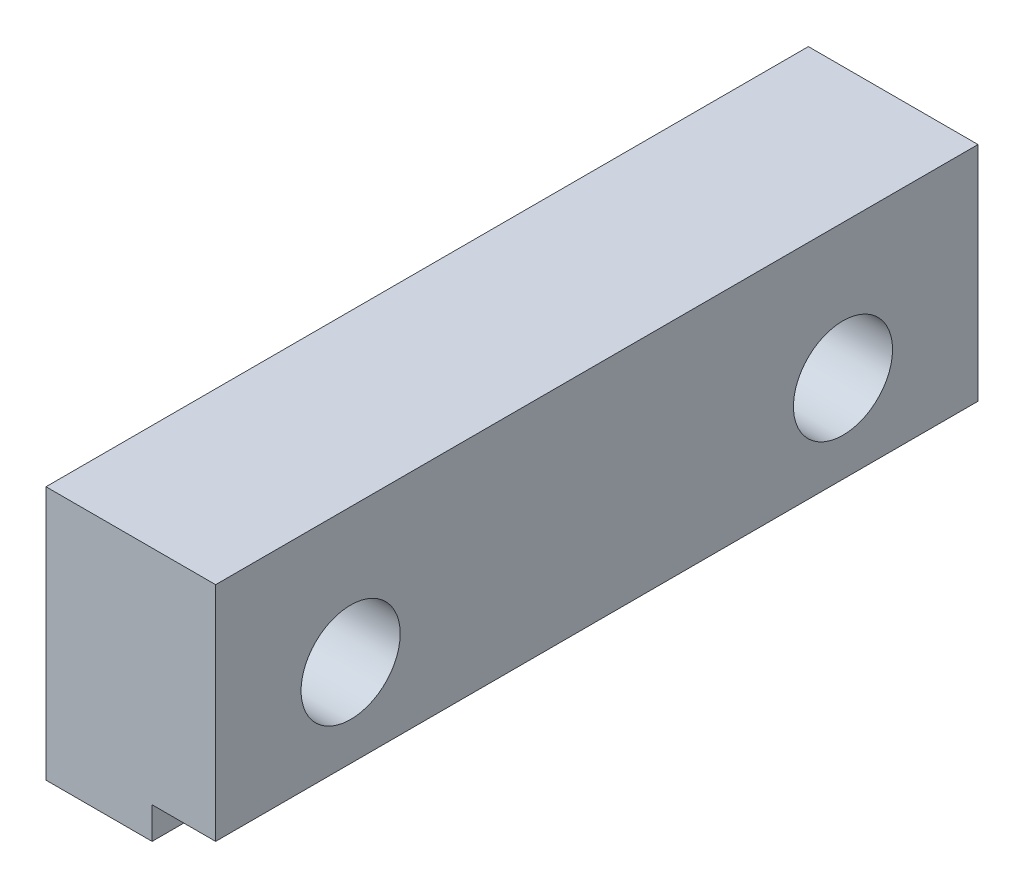
ISO-10303-21;
HEADER;
FILE_DESCRIPTION(('STEP AP214'),'2;1');
FILE_NAME('part.step','',(''),(''),'','','');
FILE_SCHEMA(('AUTOMOTIVE_DESIGN { 1 0 10303 214 1 1 1 1 }'));
ENDSEC;
DATA;
#1=APPLICATION_CONTEXT('core data for automotive mechanical design processes');
#2=APPLICATION_PROTOCOL_DEFINITION('international standard','automotive_design',2000,#1);
#3=PRODUCT_CONTEXT('',#1,'mechanical');
#4=PRODUCT('Part','Part','',(#3));
#5=PRODUCT_RELATED_PRODUCT_CATEGORY('part','',(#4));
#6=PRODUCT_DEFINITION_FORMATION('','',#4);
#7=PRODUCT_DEFINITION_CONTEXT('part definition',#1,'design');
#8=PRODUCT_DEFINITION('design','',#6,#7);
#9=PRODUCT_DEFINITION_SHAPE('','',#8);
#10=(LENGTH_UNIT() NAMED_UNIT(*) SI_UNIT(.MILLI.,.METRE.));
#11=(NAMED_UNIT(*) PLANE_ANGLE_UNIT() SI_UNIT($,.RADIAN.));
#12=(NAMED_UNIT(*) SI_UNIT($,.STERADIAN.) SOLID_ANGLE_UNIT());
#13=UNCERTAINTY_MEASURE_WITH_UNIT(LENGTH_MEASURE(1.E-05),#10,'distance_accuracy_value','');
#14=(GEOMETRIC_REPRESENTATION_CONTEXT(3) GLOBAL_UNCERTAINTY_ASSIGNED_CONTEXT((#13)) GLOBAL_UNIT_ASSIGNED_CONTEXT((#10,
#11,#12)) REPRESENTATION_CONTEXT('',''));
#15=CARTESIAN_POINT('',(0.,0.,0.));
#16=DIRECTION('',(0.,0.,1.));
#17=DIRECTION('',(1.,0.,0.));
#18=AXIS2_PLACEMENT_3D('',#15,#16,#17);
#19=CARTESIAN_POINT('',(16.9545,-25.4,76.2));
#20=DIRECTION('',(0.,1.,0.));
#21=DIRECTION('',(-1.,0.,0.));
#22=AXIS2_PLACEMENT_3D('',#19,#20,#21);
#23=PLANE('',#22);
#24=DIRECTION('',(0.,0.,-1.));
#25=VECTOR('',#24,1.);
#26=CARTESIAN_POINT('',(4.2545,-25.4,76.2));
#27=LINE('',#26,#25);
#28=CARTESIAN_POINT('',(4.2545,-25.4,76.2));
#29=VERTEX_POINT('',#28);
#30=CARTESIAN_POINT('',(4.2545,-25.4,-76.2));
#31=VERTEX_POINT('',#30);
#32=EDGE_CURVE('E131',#29,#31,#27,.T.);
#33=ORIENTED_EDGE('',*,*,#32,.F.);
#34=DIRECTION('',(1.,0.,0.));
#35=VECTOR('',#34,1.);
#36=CARTESIAN_POINT('',(16.9545,-25.4,76.2));
#37=LINE('',#36,#35);
#38=CARTESIAN_POINT('',(-16.9545,-25.4,76.2));
#39=VERTEX_POINT('',#38);
#40=EDGE_CURVE('E93',#39,#29,#37,.T.);
#41=ORIENTED_EDGE('',*,*,#40,.F.);
#42=DIRECTION('',(0.,0.,-1.));
#43=VECTOR('',#42,1.);
#44=CARTESIAN_POINT('',(-16.9545,-25.4,76.2));
#45=LINE('',#44,#43);
#46=CARTESIAN_POINT('',(-16.9545,-25.4,-76.2));
#47=VERTEX_POINT('',#46);
#48=EDGE_CURVE('E13',#39,#47,#45,.T.);
#49=ORIENTED_EDGE('',*,*,#48,.T.);
#50=DIRECTION('',(1.,0.,0.));
#51=VECTOR('',#50,1.);
#52=CARTESIAN_POINT('',(16.9545,-25.4,-76.2));
#53=LINE('',#52,#51);
#54=EDGE_CURVE('E168',#47,#31,#53,.T.);
#55=ORIENTED_EDGE('',*,*,#54,.T.);
#56=EDGE_LOOP('',(#33,#41,#49,#55));
#57=FACE_BOUND('',#56,.T.);
#58=ADVANCED_FACE('F48',(#57),#23,.F.);
#59=CARTESIAN_POINT('',(-16.9555,-1.52399999999999,-49.2125));
#60=DIRECTION('',(1.,0.,0.));
#61=DIRECTION('',(0.,0.,-1.));
#62=AXIS2_PLACEMENT_3D('',#59,#60,#61);
#63=CYLINDRICAL_SURFACE('',#62,6.731);
#64=CARTESIAN_POINT('',(-16.9545,-1.52399999999999,-49.2125));
#65=DIRECTION('',(1.,0.,0.));
#66=DIRECTION('',(0.,0.,-1.));
#67=AXIS2_PLACEMENT_3D('',#64,#65,#66);
#68=CIRCLE('',#67,6.731);
#69=CARTESIAN_POINT('',(-16.9545,-1.52399999999999,-55.9435));
#70=VERTEX_POINT('',#69);
#71=EDGE_CURVE('E156',#70,#70,#68,.F.);
#72=CARTESIAN_POINT('',(-12.0015,-1.52399999999999,-49.2125));
#73=DIRECTION('',(1.,0.,0.));
#74=DIRECTION('',(0.,0.,-1.));
#75=AXIS2_PLACEMENT_3D('',#72,#73,#74);
#76=CIRCLE('',#75,6.731);
#77=CARTESIAN_POINT('',(-12.0015,-1.52399999999999,-55.9435));
#78=VERTEX_POINT('',#77);
#79=EDGE_CURVE('E52',#78,#78,#76,.F.);
#80=CARTESIAN_POINT('',(-16.9545,-1.52399999999999,-55.9435));
#81=CARTESIAN_POINT('',(-16.90290625,-1.52399999999999,-55.9435));
#82=CARTESIAN_POINT('',(-16.8513125,-1.52399999999999,-55.9435));
#83=CARTESIAN_POINT('',(-16.748125,-1.52399999999999,-55.9435));
#84=CARTESIAN_POINT('',(-16.69653125,-1.52399999999999,-55.9435));
#85=CARTESIAN_POINT('',(-16.59334375,-1.52399999999999,-55.9435));
#86=CARTESIAN_POINT('',(-16.54175,-1.52399999999999,-55.9435));
#87=CARTESIAN_POINT('',(-16.4385625,-1.52399999999999,-55.9435));
#88=CARTESIAN_POINT('',(-16.38696875,-1.52399999999999,-55.9435));
#89=CARTESIAN_POINT('',(-16.28378125,-1.52399999999999,-55.9435));
#90=CARTESIAN_POINT('',(-16.2321875,-1.52399999999999,-55.9435));
#91=CARTESIAN_POINT('',(-16.129,-1.52399999999999,-55.9435));
#92=CARTESIAN_POINT('',(-16.07740625,-1.52399999999999,-55.9435));
#93=CARTESIAN_POINT('',(-15.97421875,-1.52399999999999,-55.9435));
#94=CARTESIAN_POINT('',(-15.922625,-1.52399999999999,-55.9435));
#95=CARTESIAN_POINT('',(-15.8194375,-1.52399999999999,-55.9435));
#96=CARTESIAN_POINT('',(-15.76784375,-1.52399999999999,-55.9435));
#97=CARTESIAN_POINT('',(-15.66465625,-1.52399999999999,-55.9435));
#98=CARTESIAN_POINT('',(-15.6130625,-1.52399999999999,-55.9435));
#99=CARTESIAN_POINT('',(-15.509875,-1.52399999999999,-55.9435));
#100=CARTESIAN_POINT('',(-15.45828125,-1.52399999999999,-55.9435));
#101=CARTESIAN_POINT('',(-15.35509375,-1.52399999999999,-55.9435));
#102=CARTESIAN_POINT('',(-15.3035,-1.52399999999999,-55.9435));
#103=CARTESIAN_POINT('',(-15.2003125,-1.52399999999999,-55.9435));
#104=CARTESIAN_POINT('',(-15.14871875,-1.52399999999999,-55.9435));
#105=CARTESIAN_POINT('',(-15.04553125,-1.52399999999999,-55.9435));
#106=CARTESIAN_POINT('',(-14.9939375,-1.52399999999999,-55.9435));
#107=CARTESIAN_POINT('',(-14.89075,-1.52399999999999,-55.9435));
#108=CARTESIAN_POINT('',(-14.83915625,-1.52399999999999,-55.9435));
#109=CARTESIAN_POINT('',(-14.73596875,-1.52399999999999,-55.9435));
#110=CARTESIAN_POINT('',(-14.684375,-1.52399999999999,-55.9435));
#111=CARTESIAN_POINT('',(-14.5811875,-1.52399999999999,-55.9435));
#112=CARTESIAN_POINT('',(-14.52959375,-1.52399999999999,-55.9435));
#113=CARTESIAN_POINT('',(-14.42640625,-1.52399999999999,-55.9435));
#114=CARTESIAN_POINT('',(-14.3748125,-1.52399999999999,-55.9435));
#115=CARTESIAN_POINT('',(-14.271625,-1.52399999999999,-55.9435));
#116=CARTESIAN_POINT('',(-14.22003125,-1.52399999999999,-55.9435));
#117=CARTESIAN_POINT('',(-14.11684375,-1.52399999999999,-55.9435));
#118=CARTESIAN_POINT('',(-14.06525,-1.52399999999999,-55.9435));
#119=CARTESIAN_POINT('',(-13.9620625,-1.52399999999999,-55.9435));
#120=CARTESIAN_POINT('',(-13.91046875,-1.52399999999999,-55.9435));
#121=CARTESIAN_POINT('',(-13.80728125,-1.52399999999999,-55.9435));
#122=CARTESIAN_POINT('',(-13.7556875,-1.52399999999999,-55.9435));
#123=CARTESIAN_POINT('',(-13.6525,-1.52399999999999,-55.9435));
#124=CARTESIAN_POINT('',(-13.60090625,-1.52399999999999,-55.9435));
#125=CARTESIAN_POINT('',(-13.49771875,-1.52399999999999,-55.9435));
#126=CARTESIAN_POINT('',(-13.446125,-1.52399999999999,-55.9435));
#127=CARTESIAN_POINT('',(-13.3429375,-1.52399999999999,-55.9435));
#128=CARTESIAN_POINT('',(-13.29134375,-1.52399999999999,-55.9435));
#129=CARTESIAN_POINT('',(-13.18815625,-1.52399999999999,-55.9435));
#130=CARTESIAN_POINT('',(-13.1365625,-1.52399999999999,-55.9435));
#131=CARTESIAN_POINT('',(-13.033375,-1.52399999999999,-55.9435));
#132=CARTESIAN_POINT('',(-12.98178125,-1.52399999999999,-55.9435));
#133=CARTESIAN_POINT('',(-12.87859375,-1.52399999999999,-55.9435));
#134=CARTESIAN_POINT('',(-12.827,-1.52399999999999,-55.9435));
#135=CARTESIAN_POINT('',(-12.7238125,-1.52399999999999,-55.9435));
#136=CARTESIAN_POINT('',(-12.67221875,-1.52399999999999,-55.9435));
#137=CARTESIAN_POINT('',(-12.56903125,-1.52399999999999,-55.9435));
#138=CARTESIAN_POINT('',(-12.5174375,-1.52399999999999,-55.9435));
#139=CARTESIAN_POINT('',(-12.41425,-1.52399999999999,-55.9435));
#140=CARTESIAN_POINT('',(-12.36265625,-1.52399999999999,-55.9435));
#141=CARTESIAN_POINT('',(-12.25946875,-1.52399999999999,-55.9435));
#142=CARTESIAN_POINT('',(-12.207875,-1.52399999999999,-55.9435));
#143=CARTESIAN_POINT('',(-12.1046875,-1.52399999999999,-55.9435));
#144=CARTESIAN_POINT('',(-12.05309375,-1.52399999999999,-55.9435));
#145=CARTESIAN_POINT('',(-12.0015,-1.52399999999999,-55.9435));
#146=B_SPLINE_CURVE_WITH_KNOTS('',3,(#80,#81,#82,#83,#84,#85,#86,#87,#88,#89,#90,#91,#92,#93,
#94,#95,#96,#97,#98,#99,#100,#101,#102,#103,#104,#105,#106,#107,#108,#109,#110,#111,#112,#113,
#114,#115,#116,#117,#118,#119,#120,#121,#122,#123,#124,#125,#126,#127,#128,#129,#130,#131,#132,
#133,#134,#135,#136,#137,#138,#139,#140,#141,#142,#143,#144,#145),.UNSPECIFIED.,.F.,.F.,(4,2,2,
2,2,2,2,2,2,2,2,2,2,2,2,2,2,2,2,2,2,2,2,2,2,2,2,2,2,2,2,2,4),(0.,0.154781250000003,
0.309562500000003,0.464343750000002,0.619125000000002,0.773906250000001,0.928687500000001,
1.08346875,1.23825,1.39303125,1.5478125,1.70259375,1.857375,2.01215625,2.1669375,2.32171875,
2.4765,2.63128125,2.7860625,2.94084375,3.095625,3.25040625,3.4051875,3.55996875,3.71475,
3.86953125,4.0243125,4.17909375,4.333875,4.48865625,4.6434375,4.79821875,4.953),.UNSPECIFIED.);
#147=EDGE_CURVE('BSEAM182',#70,#78,#146,.T.);
#148=ORIENTED_EDGE('',*,*,#71,.T.);
#149=ORIENTED_EDGE('',*,*,#79,.F.);
#150=ORIENTED_EDGE('',*,*,#147,.T.);
#151=ORIENTED_EDGE('',*,*,#147,.F.);
#152=EDGE_LOOP('',(#148,#150,#149,#151));
#153=FACE_BOUND('',#152,.T.);
#154=ADVANCED_FACE('F182',(#153),#63,.F.);
#155=CARTESIAN_POINT('',(-16.9555,-1.52399999999999,49.2125));
#156=DIRECTION('',(1.,0.,0.));
#157=DIRECTION('',(0.,0.,-1.));
#158=AXIS2_PLACEMENT_3D('',#155,#156,#157);
#159=CYLINDRICAL_SURFACE('',#158,6.731);
#160=CARTESIAN_POINT('',(-16.9545,-1.52399999999999,49.2125));
#161=DIRECTION('',(1.,0.,0.));
#162=DIRECTION('',(0.,0.,-1.));
#163=AXIS2_PLACEMENT_3D('',#160,#161,#162);
#164=CIRCLE('',#163,6.731);
#165=CARTESIAN_POINT('',(-16.9545,-1.52399999999999,42.4815));
#166=VERTEX_POINT('',#165);
#167=EDGE_CURVE('E152',#166,#166,#164,.F.);
#168=CARTESIAN_POINT('',(-12.0015,-1.52399999999999,49.2125));
#169=DIRECTION('',(1.,0.,0.));
#170=DIRECTION('',(0.,0.,-1.));
#171=AXIS2_PLACEMENT_3D('',#168,#169,#170);
#172=CIRCLE('',#171,6.731);
#173=CARTESIAN_POINT('',(-12.0015,-1.52399999999999,42.4815));
#174=VERTEX_POINT('',#173);
#175=EDGE_CURVE('E147',#174,#174,#172,.F.);
#176=CARTESIAN_POINT('',(-16.9545,-1.52399999999999,42.4815));
#177=CARTESIAN_POINT('',(-16.90290625,-1.52399999999999,42.4815));
#178=CARTESIAN_POINT('',(-16.8513125,-1.52399999999999,42.4815));
#179=CARTESIAN_POINT('',(-16.748125,-1.52399999999999,42.4815));
#180=CARTESIAN_POINT('',(-16.69653125,-1.52399999999999,42.4815));
#181=CARTESIAN_POINT('',(-16.59334375,-1.52399999999999,42.4815));
#182=CARTESIAN_POINT('',(-16.54175,-1.52399999999999,42.4815));
#183=CARTESIAN_POINT('',(-16.4385625,-1.52399999999999,42.4815));
#184=CARTESIAN_POINT('',(-16.38696875,-1.52399999999999,42.4815));
#185=CARTESIAN_POINT('',(-16.28378125,-1.52399999999999,42.4815));
#186=CARTESIAN_POINT('',(-16.2321875,-1.52399999999999,42.4815));
#187=CARTESIAN_POINT('',(-16.129,-1.52399999999999,42.4815));
#188=CARTESIAN_POINT('',(-16.07740625,-1.52399999999999,42.4815));
#189=CARTESIAN_POINT('',(-15.97421875,-1.52399999999999,42.4815));
#190=CARTESIAN_POINT('',(-15.922625,-1.52399999999999,42.4815));
#191=CARTESIAN_POINT('',(-15.8194375,-1.52399999999999,42.4815));
#192=CARTESIAN_POINT('',(-15.76784375,-1.52399999999999,42.4815));
#193=CARTESIAN_POINT('',(-15.66465625,-1.52399999999999,42.4815));
#194=CARTESIAN_POINT('',(-15.6130625,-1.52399999999999,42.4815));
#195=CARTESIAN_POINT('',(-15.509875,-1.52399999999999,42.4815));
#196=CARTESIAN_POINT('',(-15.45828125,-1.52399999999999,42.4815));
#197=CARTESIAN_POINT('',(-15.35509375,-1.52399999999999,42.4815));
#198=CARTESIAN_POINT('',(-15.3035,-1.52399999999999,42.4815));
#199=CARTESIAN_POINT('',(-15.2003125,-1.52399999999999,42.4815));
#200=CARTESIAN_POINT('',(-15.14871875,-1.52399999999999,42.4815));
#201=CARTESIAN_POINT('',(-15.04553125,-1.52399999999999,42.4815));
#202=CARTESIAN_POINT('',(-14.9939375,-1.52399999999999,42.4815));
#203=CARTESIAN_POINT('',(-14.89075,-1.52399999999999,42.4815));
#204=CARTESIAN_POINT('',(-14.83915625,-1.52399999999999,42.4815));
#205=CARTESIAN_POINT('',(-14.73596875,-1.52399999999999,42.4815));
#206=CARTESIAN_POINT('',(-14.684375,-1.52399999999999,42.4815));
#207=CARTESIAN_POINT('',(-14.5811875,-1.52399999999999,42.4815));
#208=CARTESIAN_POINT('',(-14.52959375,-1.52399999999999,42.4815));
#209=CARTESIAN_POINT('',(-14.42640625,-1.52399999999999,42.4815));
#210=CARTESIAN_POINT('',(-14.3748125,-1.52399999999999,42.4815));
#211=CARTESIAN_POINT('',(-14.271625,-1.52399999999999,42.4815));
#212=CARTESIAN_POINT('',(-14.22003125,-1.52399999999999,42.4815));
#213=CARTESIAN_POINT('',(-14.11684375,-1.52399999999999,42.4815));
#214=CARTESIAN_POINT('',(-14.06525,-1.52399999999999,42.4815));
#215=CARTESIAN_POINT('',(-13.9620625,-1.52399999999999,42.4815));
#216=CARTESIAN_POINT('',(-13.91046875,-1.52399999999999,42.4815));
#217=CARTESIAN_POINT('',(-13.80728125,-1.52399999999999,42.4815));
#218=CARTESIAN_POINT('',(-13.7556875,-1.52399999999999,42.4815));
#219=CARTESIAN_POINT('',(-13.6525,-1.52399999999999,42.4815));
#220=CARTESIAN_POINT('',(-13.60090625,-1.52399999999999,42.4815));
#221=CARTESIAN_POINT('',(-13.49771875,-1.52399999999999,42.4815));
#222=CARTESIAN_POINT('',(-13.446125,-1.52399999999999,42.4815));
#223=CARTESIAN_POINT('',(-13.3429375,-1.52399999999999,42.4815));
#224=CARTESIAN_POINT('',(-13.29134375,-1.52399999999999,42.4815));
#225=CARTESIAN_POINT('',(-13.18815625,-1.52399999999999,42.4815));
#226=CARTESIAN_POINT('',(-13.1365625,-1.52399999999999,42.4815));
#227=CARTESIAN_POINT('',(-13.033375,-1.52399999999999,42.4815));
#228=CARTESIAN_POINT('',(-12.98178125,-1.52399999999999,42.4815));
#229=CARTESIAN_POINT('',(-12.87859375,-1.52399999999999,42.4815));
#230=CARTESIAN_POINT('',(-12.827,-1.52399999999999,42.4815));
#231=CARTESIAN_POINT('',(-12.7238125,-1.52399999999999,42.4815));
#232=CARTESIAN_POINT('',(-12.67221875,-1.52399999999999,42.4815));
#233=CARTESIAN_POINT('',(-12.56903125,-1.52399999999999,42.4815));
#234=CARTESIAN_POINT('',(-12.5174375,-1.52399999999999,42.4815));
#235=CARTESIAN_POINT('',(-12.41425,-1.52399999999999,42.4815));
#236=CARTESIAN_POINT('',(-12.36265625,-1.52399999999999,42.4815));
#237=CARTESIAN_POINT('',(-12.25946875,-1.52399999999999,42.4815));
#238=CARTESIAN_POINT('',(-12.207875,-1.52399999999999,42.4815));
#239=CARTESIAN_POINT('',(-12.1046875,-1.52399999999999,42.4815));
#240=CARTESIAN_POINT('',(-12.05309375,-1.52399999999999,42.4815));
#241=CARTESIAN_POINT('',(-12.0015,-1.52399999999999,42.4815));
#242=B_SPLINE_CURVE_WITH_KNOTS('',3,(#176,#177,#178,#179,#180,#181,#182,#183,#184,#185,#186,
#187,#188,#189,#190,#191,#192,#193,#194,#195,#196,#197,#198,#199,#200,#201,#202,#203,#204,#205,
#206,#207,#208,#209,#210,#211,#212,#213,#214,#215,#216,#217,#218,#219,#220,#221,#222,#223,#224,
#225,#226,#227,#228,#229,#230,#231,#232,#233,#234,#235,#236,#237,#238,#239,#240,#241),
.UNSPECIFIED.,.F.,.F.,(4,2,2,2,2,2,2,2,2,2,2,2,2,2,2,2,2,2,2,2,2,2,2,2,2,2,2,2,2,2,2,2,4),(0.,
0.154781250000003,0.309562500000003,0.464343750000002,0.619125000000002,0.773906250000001,
0.928687500000001,1.08346875,1.23825,1.39303125,1.5478125,1.70259375,1.857375,2.01215625,
2.1669375,2.32171875,2.4765,2.63128125,2.7860625,2.94084375,3.095625,3.25040625,3.4051875,
3.55996875,3.71475,3.86953125,4.0243125,4.17909375,4.333875,4.48865625,4.6434375,4.79821875,
4.953),.UNSPECIFIED.);
#243=EDGE_CURVE('BSEAM184',#166,#174,#242,.T.);
#244=ORIENTED_EDGE('',*,*,#167,.T.);
#245=ORIENTED_EDGE('',*,*,#175,.F.);
#246=ORIENTED_EDGE('',*,*,#243,.T.);
#247=ORIENTED_EDGE('',*,*,#243,.F.);
#248=EDGE_LOOP('',(#244,#246,#245,#247));
#249=FACE_BOUND('',#248,.T.);
#250=ADVANCED_FACE('F184',(#249),#159,.F.);
#251=CARTESIAN_POINT('',(-16.9545,-25.4,76.2));
#252=DIRECTION('',(1.,0.,0.));
#253=DIRECTION('',(0.,0.,-1.));
#254=AXIS2_PLACEMENT_3D('',#251,#252,#253);
#255=PLANE('',#254);
#256=ORIENTED_EDGE('',*,*,#167,.F.);
#257=EDGE_LOOP('',(#256));
#258=FACE_BOUND('',#257,.T.);
#259=ORIENTED_EDGE('',*,*,#71,.F.);
#260=EDGE_LOOP('',(#259));
#261=FACE_BOUND('',#260,.T.);
#262=DIRECTION('',(0.,-1.,0.));
#263=VECTOR('',#262,1.);
#264=CARTESIAN_POINT('',(-16.9545,-25.4,-76.2));
#265=LINE('',#264,#263);
#266=CARTESIAN_POINT('',(-16.9545,25.4,-76.2));
#267=VERTEX_POINT('',#266);
#268=EDGE_CURVE('E155',#267,#47,#265,.T.);
#269=ORIENTED_EDGE('',*,*,#268,.T.);
#270=ORIENTED_EDGE('',*,*,#48,.F.);
#271=DIRECTION('',(0.,-1.,0.));
#272=VECTOR('',#271,1.);
#273=CARTESIAN_POINT('',(-16.9545,-25.4,76.2));
#274=LINE('',#273,#272);
#275=CARTESIAN_POINT('',(-16.9545,25.4,76.2));
#276=VERTEX_POINT('',#275);
#277=EDGE_CURVE('E159',#276,#39,#274,.T.);
#278=ORIENTED_EDGE('',*,*,#277,.F.);
#279=DIRECTION('',(0.,0.,-1.));
#280=VECTOR('',#279,1.);
#281=CARTESIAN_POINT('',(-16.9545,25.4,76.2));
#282=LINE('',#281,#280);
#283=EDGE_CURVE('E165',#276,#267,#282,.T.);
#284=ORIENTED_EDGE('',*,*,#283,.T.);
#285=EDGE_LOOP('',(#269,#270,#278,#284));
#286=FACE_BOUND('',#285,.T.);
#287=ADVANCED_FACE('F50',(#258,#261,#286),#255,.F.);
#288=CARTESIAN_POINT('',(16.9545,-25.4,76.2));
#289=DIRECTION('',(-1.,0.,0.));
#290=DIRECTION('',(0.,0.,1.));
#291=AXIS2_PLACEMENT_3D('',#288,#289,#290);
#292=PLANE('',#291);
#293=CARTESIAN_POINT('',(16.9545,-1.52399999999999,49.2125));
#294=DIRECTION('',(1.,0.,0.));
#295=DIRECTION('',(0.,0.,-1.));
#296=AXIS2_PLACEMENT_3D('',#293,#294,#295);
#297=CIRCLE('',#296,9.906);
#298=CARTESIAN_POINT('',(16.9545,-1.52399999999999,39.3065));
#299=VERTEX_POINT('',#298);
#300=EDGE_CURVE('E140',#299,#299,#297,.T.);
#301=ORIENTED_EDGE('',*,*,#300,.F.);
#302=EDGE_LOOP('',(#301));
#303=FACE_BOUND('',#302,.T.);
#304=CARTESIAN_POINT('',(16.9545,-1.52399999999999,-49.2125));
#305=DIRECTION('',(1.,0.,0.));
#306=DIRECTION('',(0.,0.,-1.));
#307=AXIS2_PLACEMENT_3D('',#304,#305,#306);
#308=CIRCLE('',#307,9.906);
#309=CARTESIAN_POINT('',(16.9545,-1.52399999999999,-59.1185));
#310=VERTEX_POINT('',#309);
#311=EDGE_CURVE('E144',#310,#310,#308,.T.);
#312=ORIENTED_EDGE('',*,*,#311,.F.);
#313=EDGE_LOOP('',(#312));
#314=FACE_BOUND('',#313,.T.);
#315=DIRECTION('',(0.,1.,0.));
#316=VECTOR('',#315,1.);
#317=CARTESIAN_POINT('',(16.9545,-25.4,76.2));
#318=LINE('',#317,#316);
#319=CARTESIAN_POINT('',(16.9545,-19.05,76.2));
#320=VERTEX_POINT('',#319);
#321=CARTESIAN_POINT('',(16.9545,25.4,76.2));
#322=VERTEX_POINT('',#321);
#323=EDGE_CURVE('E162',#320,#322,#318,.T.);
#324=ORIENTED_EDGE('',*,*,#323,.F.);
#325=DIRECTION('',(0.,0.,1.));
#326=VECTOR('',#325,1.);
#327=CARTESIAN_POINT('',(16.9545,-19.05,-76.2));
#328=LINE('',#327,#326);
#329=CARTESIAN_POINT('',(16.9545,-19.05,-76.2));
#330=VERTEX_POINT('',#329);
#331=EDGE_CURVE('E119',#330,#320,#328,.T.);
#332=ORIENTED_EDGE('',*,*,#331,.F.);
#333=DIRECTION('',(0.,1.,0.));
#334=VECTOR('',#333,1.);
#335=CARTESIAN_POINT('',(16.9545,-25.4,-76.2));
#336=LINE('',#335,#334);
#337=CARTESIAN_POINT('',(16.9545,25.4,-76.2));
#338=VERTEX_POINT('',#337);
#339=EDGE_CURVE('E82',#330,#338,#336,.T.);
#340=ORIENTED_EDGE('',*,*,#339,.T.);
#341=DIRECTION('',(0.,0.,-1.));
#342=VECTOR('',#341,1.);
#343=CARTESIAN_POINT('',(16.9545,25.4,76.2));
#344=LINE('',#343,#342);
#345=EDGE_CURVE('E58',#322,#338,#344,.T.);
#346=ORIENTED_EDGE('',*,*,#345,.F.);
#347=EDGE_LOOP('',(#324,#332,#340,#346));
#348=FACE_BOUND('',#347,.T.);
#349=ADVANCED_FACE('F206',(#303,#314,#348),#292,.F.);
#350=CARTESIAN_POINT('',(16.9545,25.4,76.2));
#351=DIRECTION('',(0.,-1.,0.));
#352=DIRECTION('',(1.,0.,0.));
#353=AXIS2_PLACEMENT_3D('',#350,#351,#352);
#354=PLANE('',#353);
#355=DIRECTION('',(-1.,0.,0.));
#356=VECTOR('',#355,1.);
#357=CARTESIAN_POINT('',(16.9545,25.4,-76.2));
#358=LINE('',#357,#356);
#359=EDGE_CURVE('E87',#338,#267,#358,.T.);
#360=ORIENTED_EDGE('',*,*,#359,.T.);
#361=ORIENTED_EDGE('',*,*,#283,.F.);
#362=DIRECTION('',(-1.,0.,0.));
#363=VECTOR('',#362,1.);
#364=CARTESIAN_POINT('',(16.9545,25.4,76.2));
#365=LINE('',#364,#363);
#366=EDGE_CURVE('E67',#322,#276,#365,.T.);
#367=ORIENTED_EDGE('',*,*,#366,.F.);
#368=ORIENTED_EDGE('',*,*,#345,.T.);
#369=EDGE_LOOP('',(#360,#361,#367,#368));
#370=FACE_BOUND('',#369,.T.);
#371=ADVANCED_FACE('F199',(#370),#354,.F.);
#372=CARTESIAN_POINT('',(0.,0.,76.2));
#373=DIRECTION('',(0.,0.,1.));
#374=DIRECTION('',(1.,0.,0.));
#375=AXIS2_PLACEMENT_3D('',#372,#373,#374);
#376=PLANE('',#375);
#377=DIRECTION('',(0.,-1.,0.));
#378=VECTOR('',#377,1.);
#379=CARTESIAN_POINT('',(4.2545,-19.05,76.2));
#380=LINE('',#379,#378);
#381=CARTESIAN_POINT('',(4.2545,-19.05,76.2));
#382=VERTEX_POINT('',#381);
#383=EDGE_CURVE('E127',#382,#29,#380,.T.);
#384=ORIENTED_EDGE('',*,*,#383,.F.);
#385=DIRECTION('',(-1.,0.,0.));
#386=VECTOR('',#385,1.);
#387=CARTESIAN_POINT('',(16.9545,-19.05,76.2));
#388=LINE('',#387,#386);
#389=EDGE_CURVE('E114',#320,#382,#388,.T.);
#390=ORIENTED_EDGE('',*,*,#389,.F.);
#391=ORIENTED_EDGE('',*,*,#323,.T.);
#392=ORIENTED_EDGE('',*,*,#366,.T.);
#393=ORIENTED_EDGE('',*,*,#277,.T.);
#394=ORIENTED_EDGE('',*,*,#40,.T.);
#395=EDGE_LOOP('',(#384,#390,#391,#392,#393,#394));
#396=FACE_BOUND('',#395,.T.);
#397=ADVANCED_FACE('F130',(#396),#376,.T.);
#398=CARTESIAN_POINT('',(0.,0.,-76.2));
#399=DIRECTION('',(0.,0.,1.));
#400=DIRECTION('',(1.,0.,0.));
#401=AXIS2_PLACEMENT_3D('',#398,#399,#400);
#402=PLANE('',#401);
#403=DIRECTION('',(-1.,0.,0.));
#404=VECTOR('',#403,1.);
#405=CARTESIAN_POINT('',(16.9545,-19.05,-76.2));
#406=LINE('',#405,#404);
#407=CARTESIAN_POINT('',(4.2545,-19.05,-76.2));
#408=VERTEX_POINT('',#407);
#409=EDGE_CURVE('E122',#330,#408,#406,.T.);
#410=ORIENTED_EDGE('',*,*,#409,.T.);
#411=DIRECTION('',(0.,1.,0.));
#412=VECTOR('',#411,1.);
#413=CARTESIAN_POINT('',(4.2545,-25.4,-76.2));
#414=LINE('',#413,#412);
#415=EDGE_CURVE('E123',#31,#408,#414,.T.);
#416=ORIENTED_EDGE('',*,*,#415,.F.);
#417=ORIENTED_EDGE('',*,*,#54,.F.);
#418=ORIENTED_EDGE('',*,*,#268,.F.);
#419=ORIENTED_EDGE('',*,*,#359,.F.);
#420=ORIENTED_EDGE('',*,*,#339,.F.);
#421=EDGE_LOOP('',(#410,#416,#417,#418,#419,#420));
#422=FACE_BOUND('',#421,.T.);
#423=ADVANCED_FACE('F198',(#422),#402,.F.);
#424=CARTESIAN_POINT('',(-12.0015,-25.4,76.2));
#425=DIRECTION('',(1.,0.,0.));
#426=DIRECTION('',(0.,0.,-1.));
#427=AXIS2_PLACEMENT_3D('',#424,#425,#426);
#428=PLANE('',#427);
#429=CARTESIAN_POINT('',(-12.0015,-1.52399999999999,49.2125));
#430=DIRECTION('',(1.,0.,0.));
#431=DIRECTION('',(0.,0.,-1.));
#432=AXIS2_PLACEMENT_3D('',#429,#430,#431);
#433=CIRCLE('',#432,9.906);
#434=CARTESIAN_POINT('',(-12.0015,-1.52399999999999,39.3065));
#435=VERTEX_POINT('',#434);
#436=EDGE_CURVE('E143',#435,#435,#433,.F.);
#437=ORIENTED_EDGE('',*,*,#436,.F.);
#438=EDGE_LOOP('',(#437));
#439=FACE_BOUND('',#438,.T.);
#440=ORIENTED_EDGE('',*,*,#175,.T.);
#441=EDGE_LOOP('',(#440));
#442=FACE_BOUND('',#441,.T.);
#443=ADVANCED_FACE('F202',(#439,#442),#428,.T.);
#444=CARTESIAN_POINT('',(-44.9728990977357,-1.52399999999999,49.2125));
#445=DIRECTION('',(1.,0.,0.));
#446=DIRECTION('',(0.,0.,-1.));
#447=AXIS2_PLACEMENT_3D('',#444,#445,#446);
#448=CYLINDRICAL_SURFACE('',#447,9.906);
#449=ORIENTED_EDGE('',*,*,#436,.T.);
#450=EDGE_LOOP('',(#449));
#451=FACE_BOUND('',#450,.T.);
#452=ORIENTED_EDGE('',*,*,#300,.T.);
#453=EDGE_LOOP('',(#452));
#454=FACE_BOUND('',#453,.T.);
#455=ADVANCED_FACE('F229',(#451,#454),#448,.F.);
#456=CARTESIAN_POINT('',(-12.0015,-25.4,76.2));
#457=DIRECTION('',(1.,0.,0.));
#458=DIRECTION('',(0.,0.,-1.));
#459=AXIS2_PLACEMENT_3D('',#456,#457,#458);
#460=PLANE('',#459);
#461=CARTESIAN_POINT('',(-12.0015,-1.52399999999999,-49.2125));
#462=DIRECTION('',(1.,0.,0.));
#463=DIRECTION('',(0.,0.,-1.));
#464=AXIS2_PLACEMENT_3D('',#461,#462,#463);
#465=CIRCLE('',#464,9.906);
#466=CARTESIAN_POINT('',(-12.0015,-1.52399999999999,-59.1185));
#467=VERTEX_POINT('',#466);
#468=EDGE_CURVE('E139',#467,#467,#465,.F.);
#469=ORIENTED_EDGE('',*,*,#468,.F.);
#470=EDGE_LOOP('',(#469));
#471=FACE_BOUND('',#470,.T.);
#472=ORIENTED_EDGE('',*,*,#79,.T.);
#473=EDGE_LOOP('',(#472));
#474=FACE_BOUND('',#473,.T.);
#475=ADVANCED_FACE('F180',(#471,#474),#460,.T.);
#476=CARTESIAN_POINT('',(-44.9728990977357,-1.52399999999999,-49.2125));
#477=DIRECTION('',(1.,0.,0.));
#478=DIRECTION('',(0.,0.,-1.));
#479=AXIS2_PLACEMENT_3D('',#476,#477,#478);
#480=CYLINDRICAL_SURFACE('',#479,9.906);
#481=ORIENTED_EDGE('',*,*,#468,.T.);
#482=EDGE_LOOP('',(#481));
#483=FACE_BOUND('',#482,.T.);
#484=ORIENTED_EDGE('',*,*,#311,.T.);
#485=EDGE_LOOP('',(#484));
#486=FACE_BOUND('',#485,.T.);
#487=ADVANCED_FACE('F221',(#483,#486),#480,.F.);
#488=CARTESIAN_POINT('',(16.9545,-19.05,-76.2));
#489=DIRECTION('',(0.,1.,0.));
#490=DIRECTION('',(-1.,0.,0.));
#491=AXIS2_PLACEMENT_3D('',#488,#489,#490);
#492=PLANE('',#491);
#493=ORIENTED_EDGE('',*,*,#389,.T.);
#494=DIRECTION('',(0.,0.,1.));
#495=VECTOR('',#494,1.);
#496=CARTESIAN_POINT('',(4.2545,-19.05,-76.2));
#497=LINE('',#496,#495);
#498=EDGE_CURVE('E117',#408,#382,#497,.T.);
#499=ORIENTED_EDGE('',*,*,#498,.F.);
#500=ORIENTED_EDGE('',*,*,#409,.F.);
#501=ORIENTED_EDGE('',*,*,#331,.T.);
#502=EDGE_LOOP('',(#493,#499,#500,#501));
#503=FACE_BOUND('',#502,.T.);
#504=ADVANCED_FACE('F116',(#503),#492,.F.);
#505=CARTESIAN_POINT('',(4.2545,0.,0.));
#506=DIRECTION('',(1.,0.,0.));
#507=DIRECTION('',(0.,0.,-1.));
#508=AXIS2_PLACEMENT_3D('',#505,#506,#507);
#509=PLANE('',#508);
#510=ORIENTED_EDGE('',*,*,#498,.T.);
#511=ORIENTED_EDGE('',*,*,#383,.T.);
#512=ORIENTED_EDGE('',*,*,#32,.T.);
#513=ORIENTED_EDGE('',*,*,#415,.T.);
#514=EDGE_LOOP('',(#510,#511,#512,#513));
#515=FACE_BOUND('',#514,.T.);
#516=ADVANCED_FACE('F126',(#515),#509,.T.);
#517=CLOSED_SHELL('',(#58,#154,#250,#287,#349,#371,#397,#423,#443,#455,#475,#487,#504,#516));
#518=MANIFOLD_SOLID_BREP('B2',#517);
#519=ADVANCED_BREP_SHAPE_REPRESENTATION('',(#18,#518),#14);
#520=SHAPE_DEFINITION_REPRESENTATION(#9,#519);
ENDSEC;
END-ISO-10303-21;
